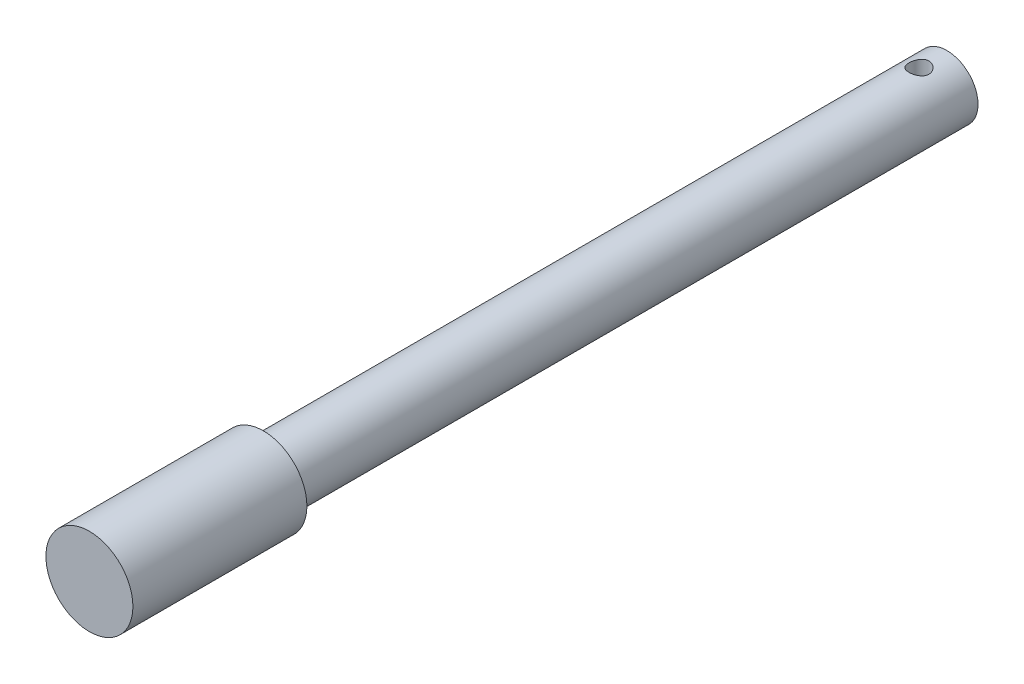
ISO-10303-21;
HEADER;
FILE_DESCRIPTION(('STEP AP214'),'2;1');
FILE_NAME('part.step','',(''),(''),'','','');
FILE_SCHEMA(('AUTOMOTIVE_DESIGN { 1 0 10303 214 1 1 1 1 }'));
ENDSEC;
DATA;
#1=APPLICATION_CONTEXT('core data for automotive mechanical design processes');
#2=APPLICATION_PROTOCOL_DEFINITION('international standard','automotive_design',2000,#1);
#3=PRODUCT_CONTEXT('',#1,'mechanical');
#4=PRODUCT('Part','Part','',(#3));
#5=PRODUCT_RELATED_PRODUCT_CATEGORY('part','',(#4));
#6=PRODUCT_DEFINITION_FORMATION('','',#4);
#7=PRODUCT_DEFINITION_CONTEXT('part definition',#1,'design');
#8=PRODUCT_DEFINITION('design','',#6,#7);
#9=PRODUCT_DEFINITION_SHAPE('','',#8);
#10=(LENGTH_UNIT() NAMED_UNIT(*) SI_UNIT(.MILLI.,.METRE.));
#11=(NAMED_UNIT(*) PLANE_ANGLE_UNIT() SI_UNIT($,.RADIAN.));
#12=(NAMED_UNIT(*) SI_UNIT($,.STERADIAN.) SOLID_ANGLE_UNIT());
#13=UNCERTAINTY_MEASURE_WITH_UNIT(LENGTH_MEASURE(1.E-05),#10,'distance_accuracy_value','');
#14=(GEOMETRIC_REPRESENTATION_CONTEXT(3) GLOBAL_UNCERTAINTY_ASSIGNED_CONTEXT((#13)) GLOBAL_UNIT_ASSIGNED_CONTEXT((#10,
#11,#12)) REPRESENTATION_CONTEXT('',''));
#15=CARTESIAN_POINT('',(0.,0.,0.));
#16=DIRECTION('',(0.,0.,1.));
#17=DIRECTION('',(1.,0.,0.));
#18=AXIS2_PLACEMENT_3D('',#15,#16,#17);
#19=CARTESIAN_POINT('',(0.,0.,276.));
#20=DIRECTION('',(0.,0.,-1.));
#21=DIRECTION('',(-1.,0.,0.));
#22=AXIS2_PLACEMENT_3D('',#19,#20,#21);
#23=CYLINDRICAL_SURFACE('',#22,10.);
#24=CARTESIAN_POINT('',(0.,0.,0.));
#25=DIRECTION('',(0.,0.,1.));
#26=DIRECTION('',(1.,0.,0.));
#27=AXIS2_PLACEMENT_3D('',#24,#25,#26);
#28=CIRCLE('',#27,10.);
#29=CARTESIAN_POINT('',(10.,0.,0.));
#30=VERTEX_POINT('',#29);
#31=EDGE_CURVE('E49',#30,#30,#28,.T.);
#32=ORIENTED_EDGE('',*,*,#31,.T.);
#33=EDGE_LOOP('',(#32));
#34=FACE_BOUND('',#33,.T.);
#35=CARTESIAN_POINT('',(0.,0.,220.));
#36=DIRECTION('',(0.,0.,1.));
#37=DIRECTION('',(1.,0.,0.));
#38=AXIS2_PLACEMENT_3D('',#35,#36,#37);
#39=CIRCLE('',#38,10.);
#40=CARTESIAN_POINT('',(10.,0.,220.));
#41=VERTEX_POINT('',#40);
#42=EDGE_CURVE('E10',#41,#41,#39,.T.);
#43=ORIENTED_EDGE('',*,*,#42,.F.);
#44=EDGE_LOOP('',(#43));
#45=FACE_BOUND('',#44,.T.);
#46=CARTESIAN_POINT('',(0.,-10.,5.8));
#47=CARTESIAN_POINT('',(0.17499161263196,-9.99999957087253,5.80000048730117));
#48=CARTESIAN_POINT('',(0.349989274118122,-9.99536368312711,5.81440119055851));
#49=CARTESIAN_POINT('',(0.694853802474966,-9.97732524344453,5.87146363905852));
#50=CARTESIAN_POINT('',(0.864719726747416,-9.96392109107117,5.91413054363582));
#51=CARTESIAN_POINT('',(1.19429845158313,-9.92980767270819,6.02612984242354));
#52=CARTESIAN_POINT('',(1.35402694676919,-9.90911004090383,6.09541978474121));
#53=CARTESIAN_POINT('',(1.65959752570232,-9.86253803285744,6.25851366017452));
#54=CARTESIAN_POINT('',(1.80543721404989,-9.83666276600771,6.35232181153122));
#55=CARTESIAN_POINT('',(2.08378951558996,-9.7815413586765,6.56496822700806));
#56=CARTESIAN_POINT('',(2.21579218449281,-9.75221915465836,6.68445419790684));
#57=CARTESIAN_POINT('',(2.45826847386456,-9.6939413140614,6.94368613309481));
#58=CARTESIAN_POINT('',(2.56873783587594,-9.66498575104657,7.08343609530974));
#59=CARTESIAN_POINT('',(2.76782790147663,-9.60989621598059,7.38370570902077));
#60=CARTESIAN_POINT('',(2.85580246219888,-9.58385571270834,7.54467256254109));
#61=CARTESIAN_POINT('',(3.0032183426918,-9.53869315597291,7.88008468754022));
#62=CARTESIAN_POINT('',(3.06266759546653,-9.51956917936032,8.05452619597661));
#63=CARTESIAN_POINT('',(3.14946268622643,-9.49120245521194,8.40616521454576));
#64=CARTESIAN_POINT('',(3.17775793692771,-9.48166829865489,8.58310420350407));
#65=CARTESIAN_POINT('',(3.20440866117701,-9.4726966209,8.93945519836891));
#66=CARTESIAN_POINT('',(3.2027725418744,-9.47325626454612,9.11886649570395));
#67=CARTESIAN_POINT('',(3.17034761472761,-9.4841523820015,9.46713116977648));
#68=CARTESIAN_POINT('',(3.14077684265449,-9.4940803486084,9.63611290688941));
#69=CARTESIAN_POINT('',(3.05530117948278,-9.52192914892323,9.96657768884413));
#70=CARTESIAN_POINT('',(2.99939336538654,-9.5398508698005,10.1280598991704));
#71=CARTESIAN_POINT('',(2.86199290317624,-9.5819730832728,10.4417957176515));
#72=CARTESIAN_POINT('',(2.78012546207445,-9.60626458938725,10.593872439903));
#73=CARTESIAN_POINT('',(2.59338988668135,-9.65834889722336,10.8825240860535));
#74=CARTESIAN_POINT('',(2.4885155365431,-9.68614264429081,11.0190948054871));
#75=CARTESIAN_POINT('',(2.25281103080773,-9.74372744283743,11.2797293457326));
#76=CARTESIAN_POINT('',(2.12097872498805,-9.77355041616361,11.4028815538776));
#77=CARTESIAN_POINT('',(1.8381628644343,-9.83066336229755,11.6255573564673));
#78=CARTESIAN_POINT('',(1.68717775130539,-9.85795312867414,11.7250790262858));
#79=CARTESIAN_POINT('',(1.36852316142475,-9.90723579489168,11.8983268865604));
#80=CARTESIAN_POINT('',(1.20072255888127,-9.92918161095884,11.9718262016729));
#81=CARTESIAN_POINT('',(0.85427170072226,-9.96496322200393,12.0892791933254));
#82=CARTESIAN_POINT('',(0.675624926263095,-9.97880160409274,12.1332422956334));
#83=CARTESIAN_POINT('',(0.320283579178635,-9.99638848478269,12.1888001333304));
#84=CARTESIAN_POINT('',(0.143800572034146,-10.0005212035631,12.2016281472222));
#85=CARTESIAN_POINT('',(-0.208820539176213,-9.99937310636888,12.1980415635574));
#86=CARTESIAN_POINT('',(-0.38495869217488,-9.99409374008412,12.1816314693802));
#87=CARTESIAN_POINT('',(-0.727070036407625,-9.97496760634994,12.1210197738377));
#88=CARTESIAN_POINT('',(-0.893188724956047,-9.96134973298532,12.0775601798282));
#89=CARTESIAN_POINT('',(-1.21572330920117,-9.92715171990697,11.9649964012075));
#90=CARTESIAN_POINT('',(-1.37213798758825,-9.90657070879093,11.8958890067956));
#91=CARTESIAN_POINT('',(-1.67519384774089,-9.8599106203981,11.7320579656437));
#92=CARTESIAN_POINT('',(-1.82149124100193,-9.8337065254018,11.6367349761154));
#93=CARTESIAN_POINT('',(-2.09642300601324,-9.7787881648096,11.4238922540287));
#94=CARTESIAN_POINT('',(-2.22505235110797,-9.75007318864156,11.3063662270834));
#95=CARTESIAN_POINT('',(-2.46656642977271,-9.69185934566474,11.0466516807781));
#96=CARTESIAN_POINT('',(-2.57857158951241,-9.6623776833347,10.903639464623));
#97=CARTESIAN_POINT('',(-2.77708283985139,-9.6072088622029,10.6002106510836));
#98=CARTESIAN_POINT('',(-2.86358914051283,-9.58152167214276,10.4397941970919));
#99=CARTESIAN_POINT('',(-3.00815160602463,-9.5371252577315,10.1063128426878));
#100=CARTESIAN_POINT('',(-3.06630132614892,-9.51839313640102,9.93329173002062));
#101=CARTESIAN_POINT('',(-3.15241336492402,-9.49022563398656,9.57918558037935));
#102=CARTESIAN_POINT('',(-3.18038790013134,-9.48078649073467,9.39810383772803));
#103=CARTESIAN_POINT('',(-3.20445070623132,-9.47267855797536,9.04224806167202));
#104=CARTESIAN_POINT('',(-3.20198776892012,-9.47352038182764,8.86758197734201));
#105=CARTESIAN_POINT('',(-3.1687671029874,-9.4846831818749,8.52128598913059));
#106=CARTESIAN_POINT('',(-3.13801081722242,-9.49500367469264,8.34965593087794));
#107=CARTESIAN_POINT('',(-3.05006664832922,-9.52361086288832,8.01703314924623));
#108=CARTESIAN_POINT('',(-2.99331255885413,-9.54176654473526,7.85591360221426));
#109=CARTESIAN_POINT('',(-2.85532854968764,-9.58395951188724,7.54535647919837));
#110=CARTESIAN_POINT('',(-2.77409348229251,-9.60799803399839,7.3959213684746));
#111=CARTESIAN_POINT('',(-2.58558533414864,-9.66046988736752,7.10638074037118));
#112=CARTESIAN_POINT('',(-2.47738616863157,-9.68904238105361,6.96690347453191));
#113=CARTESIAN_POINT('',(-2.23962799585769,-9.74674361694707,6.70761650835808));
#114=CARTESIAN_POINT('',(-2.11006316333646,-9.77587250893391,6.58781218960271));
#115=CARTESIAN_POINT('',(-1.8278244205967,-9.83262216400234,6.36708342815233));
#116=CARTESIAN_POINT('',(-1.67450270352156,-9.86015503760771,6.26696209623139));
#117=CARTESIAN_POINT('',(-1.35232705985387,-9.90947575395721,6.09403962380555));
#118=CARTESIAN_POINT('',(-1.18347852641631,-9.93126558142587,6.02122904135841));
#119=CARTESIAN_POINT('',(-0.847326863289691,-9.96536682128131,5.90950444033912));
#120=CARTESIAN_POINT('',(-0.680753532974662,-9.97823802602901,5.86856309883378));
#121=CARTESIAN_POINT('',(-0.342788002152241,-9.99555387082788,5.81381371419197));
#122=CARTESIAN_POINT('',(-0.17139690252279,-10.0000004203123,5.79999952270906));
#123=CARTESIAN_POINT('',(0.,-10.,5.8));
#124=B_SPLINE_CURVE_WITH_KNOTS('',3,(#46,#47,#48,#49,#50,#51,#52,#53,#54,#55,#56,#57,#58,#59,
#60,#61,#62,#63,#64,#65,#66,#67,#68,#69,#70,#71,#72,#73,#74,#75,#76,#77,#78,#79,#80,#81,#82,#83,
#84,#85,#86,#87,#88,#89,#90,#91,#92,#93,#94,#95,#96,#97,#98,#99,#100,#101,#102,#103,#104,#105,
#106,#107,#108,#109,#110,#111,#112,#113,#114,#115,#116,#117,#118,#119,#120,#121,#122,#123),
.UNSPECIFIED.,.T.,.F.,(4,2,2,2,2,2,2,2,2,2,2,2,2,2,2,2,2,2,2,2,2,2,2,2,2,2,2,2,2,2,2,2,2,2,2,2,
2,2,4),(0.,0.524344579732975,1.04878489269673,1.57239240422343,2.09609005929406,
2.63499436303134,3.17400513336852,3.72709657653253,4.2800341134391,4.81560979999013,
5.35103505588447,5.86414178702891,6.37730547837556,6.89824391869526,7.41932327626018,
7.96534569617247,8.5114125724911,9.06212942668389,9.61267044932697,10.1410202118269,
10.669288602654,11.1836683277558,11.6981124487667,12.2254671011016,12.7529714792964,
13.3024598610612,13.8519437159588,14.3996022135021,14.9470389057759,15.4685226994569,
15.9899799008598,16.5030364576263,17.0162009720141,17.5502751335184,18.0844951497117,
18.6373257106252,19.1899649689946,19.7036548061069,20.2172282023923),.UNSPECIFIED.);
#125=CARTESIAN_POINT('',(0.,-10.,5.8));
#126=VERTEX_POINT('',#125);
#127=EDGE_CURVE('E58',#126,#126,#124,.T.);
#128=ORIENTED_EDGE('',*,*,#127,.F.);
#129=EDGE_LOOP('',(#128));
#130=FACE_BOUND('',#129,.T.);
#131=CARTESIAN_POINT('',(0.,10.,5.8));
#132=CARTESIAN_POINT('',(-0.17499161263196,9.99999957087253,5.80000048730117));
#133=CARTESIAN_POINT('',(-0.349989274118122,9.99536368312711,5.81440119055851));
#134=CARTESIAN_POINT('',(-0.694853802474966,9.97732524344453,5.87146363905852));
#135=CARTESIAN_POINT('',(-0.864719726747416,9.96392109107117,5.91413054363582));
#136=CARTESIAN_POINT('',(-1.19429845158313,9.92980767270819,6.02612984242354));
#137=CARTESIAN_POINT('',(-1.35402694676919,9.90911004090383,6.09541978474121));
#138=CARTESIAN_POINT('',(-1.65959752570232,9.86253803285744,6.25851366017452));
#139=CARTESIAN_POINT('',(-1.80543721404989,9.83666276600771,6.35232181153122));
#140=CARTESIAN_POINT('',(-2.08378951558996,9.7815413586765,6.56496822700806));
#141=CARTESIAN_POINT('',(-2.21579218449281,9.75221915465836,6.68445419790684));
#142=CARTESIAN_POINT('',(-2.45826847386456,9.6939413140614,6.94368613309481));
#143=CARTESIAN_POINT('',(-2.56873783587594,9.66498575104657,7.08343609530974));
#144=CARTESIAN_POINT('',(-2.76782790147663,9.60989621598059,7.38370570902077));
#145=CARTESIAN_POINT('',(-2.85580246219888,9.58385571270834,7.54467256254109));
#146=CARTESIAN_POINT('',(-3.0032183426918,9.53869315597291,7.88008468754022));
#147=CARTESIAN_POINT('',(-3.06266759546653,9.51956917936032,8.05452619597661));
#148=CARTESIAN_POINT('',(-3.14946268622643,9.49120245521194,8.40616521454576));
#149=CARTESIAN_POINT('',(-3.17775793692771,9.48166829865489,8.58310420350407));
#150=CARTESIAN_POINT('',(-3.20440866117701,9.4726966209,8.93945519836891));
#151=CARTESIAN_POINT('',(-3.2027725418744,9.47325626454612,9.11886649570395));
#152=CARTESIAN_POINT('',(-3.17034761472761,9.4841523820015,9.46713116977648));
#153=CARTESIAN_POINT('',(-3.14077684265449,9.4940803486084,9.63611290688941));
#154=CARTESIAN_POINT('',(-3.05530117948278,9.52192914892323,9.96657768884413));
#155=CARTESIAN_POINT('',(-2.99939336538654,9.5398508698005,10.1280598991704));
#156=CARTESIAN_POINT('',(-2.86199290317624,9.5819730832728,10.4417957176515));
#157=CARTESIAN_POINT('',(-2.78012546207445,9.60626458938725,10.593872439903));
#158=CARTESIAN_POINT('',(-2.59338988668135,9.65834889722336,10.8825240860535));
#159=CARTESIAN_POINT('',(-2.4885155365431,9.68614264429081,11.0190948054871));
#160=CARTESIAN_POINT('',(-2.25281103080773,9.74372744283743,11.2797293457326));
#161=CARTESIAN_POINT('',(-2.12097872498805,9.77355041616361,11.4028815538776));
#162=CARTESIAN_POINT('',(-1.8381628644343,9.83066336229755,11.6255573564673));
#163=CARTESIAN_POINT('',(-1.68717775130539,9.85795312867414,11.7250790262858));
#164=CARTESIAN_POINT('',(-1.36852316142475,9.90723579489168,11.8983268865604));
#165=CARTESIAN_POINT('',(-1.20072255888127,9.92918161095884,11.9718262016729));
#166=CARTESIAN_POINT('',(-0.85427170072226,9.96496322200393,12.0892791933254));
#167=CARTESIAN_POINT('',(-0.675624926263095,9.97880160409274,12.1332422956334));
#168=CARTESIAN_POINT('',(-0.320283579178635,9.99638848478269,12.1888001333304));
#169=CARTESIAN_POINT('',(-0.143800572034146,10.0005212035631,12.2016281472222));
#170=CARTESIAN_POINT('',(0.208820539176213,9.99937310636888,12.1980415635574));
#171=CARTESIAN_POINT('',(0.38495869217488,9.99409374008412,12.1816314693802));
#172=CARTESIAN_POINT('',(0.727070036407625,9.97496760634994,12.1210197738377));
#173=CARTESIAN_POINT('',(0.893188724956047,9.96134973298532,12.0775601798282));
#174=CARTESIAN_POINT('',(1.21572330920117,9.92715171990697,11.9649964012075));
#175=CARTESIAN_POINT('',(1.37213798758825,9.90657070879093,11.8958890067956));
#176=CARTESIAN_POINT('',(1.67519384774089,9.8599106203981,11.7320579656437));
#177=CARTESIAN_POINT('',(1.82149124100193,9.8337065254018,11.6367349761154));
#178=CARTESIAN_POINT('',(2.09642300601324,9.7787881648096,11.4238922540287));
#179=CARTESIAN_POINT('',(2.22505235110797,9.75007318864156,11.3063662270834));
#180=CARTESIAN_POINT('',(2.46656642977271,9.69185934566474,11.0466516807781));
#181=CARTESIAN_POINT('',(2.57857158951241,9.6623776833347,10.903639464623));
#182=CARTESIAN_POINT('',(2.77708283985139,9.6072088622029,10.6002106510836));
#183=CARTESIAN_POINT('',(2.86358914051283,9.58152167214276,10.4397941970919));
#184=CARTESIAN_POINT('',(3.00815160602463,9.5371252577315,10.1063128426878));
#185=CARTESIAN_POINT('',(3.06630132614892,9.51839313640102,9.93329173002062));
#186=CARTESIAN_POINT('',(3.15241336492402,9.49022563398656,9.57918558037935));
#187=CARTESIAN_POINT('',(3.18038790013134,9.48078649073467,9.39810383772803));
#188=CARTESIAN_POINT('',(3.20445070623132,9.47267855797536,9.04224806167202));
#189=CARTESIAN_POINT('',(3.20198776892012,9.47352038182764,8.86758197734201));
#190=CARTESIAN_POINT('',(3.1687671029874,9.4846831818749,8.52128598913059));
#191=CARTESIAN_POINT('',(3.13801081722242,9.49500367469264,8.34965593087794));
#192=CARTESIAN_POINT('',(3.05006664832922,9.52361086288832,8.01703314924623));
#193=CARTESIAN_POINT('',(2.99331255885413,9.54176654473526,7.85591360221426));
#194=CARTESIAN_POINT('',(2.85532854968764,9.58395951188724,7.54535647919837));
#195=CARTESIAN_POINT('',(2.77409348229251,9.60799803399839,7.3959213684746));
#196=CARTESIAN_POINT('',(2.58558533414864,9.66046988736752,7.10638074037118));
#197=CARTESIAN_POINT('',(2.47738616863157,9.68904238105361,6.96690347453191));
#198=CARTESIAN_POINT('',(2.23962799585769,9.74674361694707,6.70761650835808));
#199=CARTESIAN_POINT('',(2.11006316333646,9.77587250893391,6.58781218960271));
#200=CARTESIAN_POINT('',(1.8278244205967,9.83262216400234,6.36708342815233));
#201=CARTESIAN_POINT('',(1.67450270352156,9.86015503760771,6.26696209623139));
#202=CARTESIAN_POINT('',(1.35232705985387,9.90947575395721,6.09403962380555));
#203=CARTESIAN_POINT('',(1.18347852641631,9.93126558142587,6.02122904135841));
#204=CARTESIAN_POINT('',(0.847326863289691,9.96536682128131,5.90950444033912));
#205=CARTESIAN_POINT('',(0.680753532974662,9.97823802602901,5.86856309883378));
#206=CARTESIAN_POINT('',(0.342788002152241,9.99555387082788,5.81381371419197));
#207=CARTESIAN_POINT('',(0.17139690252279,10.0000004203123,5.79999952270906));
#208=CARTESIAN_POINT('',(0.,10.,5.8));
#209=B_SPLINE_CURVE_WITH_KNOTS('',3,(#131,#132,#133,#134,#135,#136,#137,#138,#139,#140,#141,
#142,#143,#144,#145,#146,#147,#148,#149,#150,#151,#152,#153,#154,#155,#156,#157,#158,#159,#160,
#161,#162,#163,#164,#165,#166,#167,#168,#169,#170,#171,#172,#173,#174,#175,#176,#177,#178,#179,
#180,#181,#182,#183,#184,#185,#186,#187,#188,#189,#190,#191,#192,#193,#194,#195,#196,#197,#198,
#199,#200,#201,#202,#203,#204,#205,#206,#207,#208),.UNSPECIFIED.,.T.,.F.,(4,2,2,2,2,2,2,2,2,2,2,
2,2,2,2,2,2,2,2,2,2,2,2,2,2,2,2,2,2,2,2,2,2,2,2,2,2,2,4),(0.,0.524344579732975,1.04878489269673,
1.57239240422343,2.09609005929406,2.63499436303134,3.17400513336852,3.72709657653253,
4.2800341134391,4.81560979999013,5.35103505588447,5.86414178702891,6.37730547837556,
6.89824391869526,7.41932327626018,7.96534569617247,8.5114125724911,9.06212942668389,
9.61267044932697,10.1410202118269,10.669288602654,11.1836683277558,11.6981124487667,
12.2254671011016,12.7529714792964,13.3024598610612,13.8519437159588,14.3996022135021,
14.9470389057759,15.4685226994569,15.9899799008598,16.5030364576263,17.0162009720141,
17.5502751335184,18.0844951497117,18.6373257106252,19.1899649689946,19.7036548061069,
20.2172282023923),.UNSPECIFIED.);
#210=CARTESIAN_POINT('',(0.,10.,5.8));
#211=VERTEX_POINT('',#210);
#212=EDGE_CURVE('E40',#211,#211,#209,.T.);
#213=ORIENTED_EDGE('',*,*,#212,.F.);
#214=EDGE_LOOP('',(#213));
#215=FACE_BOUND('',#214,.T.);
#216=ADVANCED_FACE('F36',(#34,#45,#130,#215),#23,.T.);
#217=CARTESIAN_POINT('',(0.,0.,0.));
#218=DIRECTION('',(0.,0.,1.));
#219=DIRECTION('',(1.,0.,0.));
#220=AXIS2_PLACEMENT_3D('',#217,#218,#219);
#221=PLANE('',#220);
#222=ORIENTED_EDGE('',*,*,#31,.F.);
#223=EDGE_LOOP('',(#222));
#224=FACE_BOUND('',#223,.T.);
#225=ADVANCED_FACE('F77',(#224),#221,.F.);
#226=CARTESIAN_POINT('',(0.,0.,220.));
#227=DIRECTION('',(0.,0.,1.));
#228=DIRECTION('',(1.,0.,0.));
#229=AXIS2_PLACEMENT_3D('',#226,#227,#228);
#230=CYLINDRICAL_SURFACE('',#229,14.);
#231=CARTESIAN_POINT('',(0.,0.,220.));
#232=DIRECTION('',(0.,0.,1.));
#233=DIRECTION('',(1.,0.,0.));
#234=AXIS2_PLACEMENT_3D('',#231,#232,#233);
#235=CIRCLE('',#234,14.);
#236=CARTESIAN_POINT('',(14.,0.,220.));
#237=VERTEX_POINT('',#236);
#238=EDGE_CURVE('E55',#237,#237,#235,.T.);
#239=ORIENTED_EDGE('',*,*,#238,.T.);
#240=EDGE_LOOP('',(#239));
#241=FACE_BOUND('',#240,.T.);
#242=CARTESIAN_POINT('',(0.,0.,276.));
#243=DIRECTION('',(0.,0.,1.));
#244=DIRECTION('',(1.,0.,0.));
#245=AXIS2_PLACEMENT_3D('',#242,#243,#244);
#246=CIRCLE('',#245,14.);
#247=CARTESIAN_POINT('',(14.,0.,276.));
#248=VERTEX_POINT('',#247);
#249=EDGE_CURVE('E96',#248,#248,#246,.T.);
#250=ORIENTED_EDGE('',*,*,#249,.F.);
#251=EDGE_LOOP('',(#250));
#252=FACE_BOUND('',#251,.T.);
#253=ADVANCED_FACE('F74',(#241,#252),#230,.T.);
#254=CARTESIAN_POINT('',(0.,0.,220.));
#255=DIRECTION('',(0.,0.,1.));
#256=DIRECTION('',(1.,0.,0.));
#257=AXIS2_PLACEMENT_3D('',#254,#255,#256);
#258=PLANE('',#257);
#259=ORIENTED_EDGE('',*,*,#42,.T.);
#260=EDGE_LOOP('',(#259));
#261=FACE_BOUND('',#260,.T.);
#262=ORIENTED_EDGE('',*,*,#238,.F.);
#263=EDGE_LOOP('',(#262));
#264=FACE_BOUND('',#263,.T.);
#265=ADVANCED_FACE('F70',(#261,#264),#258,.F.);
#266=CARTESIAN_POINT('',(0.,0.,276.));
#267=DIRECTION('',(0.,0.,1.));
#268=DIRECTION('',(1.,0.,0.));
#269=AXIS2_PLACEMENT_3D('',#266,#267,#268);
#270=PLANE('',#269);
#271=ORIENTED_EDGE('',*,*,#249,.T.);
#272=EDGE_LOOP('',(#271));
#273=FACE_BOUND('',#272,.T.);
#274=ADVANCED_FACE('F68',(#273),#270,.T.);
#275=CARTESIAN_POINT('',(0.,56.,9.));
#276=DIRECTION('',(0.,-1.,0.));
#277=DIRECTION('',(0.,0.,-1.));
#278=AXIS2_PLACEMENT_3D('',#275,#276,#277);
#279=CYLINDRICAL_SURFACE('',#278,3.2);
#280=ORIENTED_EDGE('',*,*,#127,.T.);
#281=EDGE_LOOP('',(#280));
#282=FACE_BOUND('',#281,.T.);
#283=ORIENTED_EDGE('',*,*,#212,.T.);
#284=EDGE_LOOP('',(#283));
#285=FACE_BOUND('',#284,.T.);
#286=ADVANCED_FACE('F64',(#282,#285),#279,.F.);
#287=CLOSED_SHELL('',(#216,#225,#253,#265,#274,#286));
#288=MANIFOLD_SOLID_BREP('B2',#287);
#289=ADVANCED_BREP_SHAPE_REPRESENTATION('',(#18,#288),#14);
#290=SHAPE_DEFINITION_REPRESENTATION(#9,#289);
ENDSEC;
END-ISO-10303-21;
